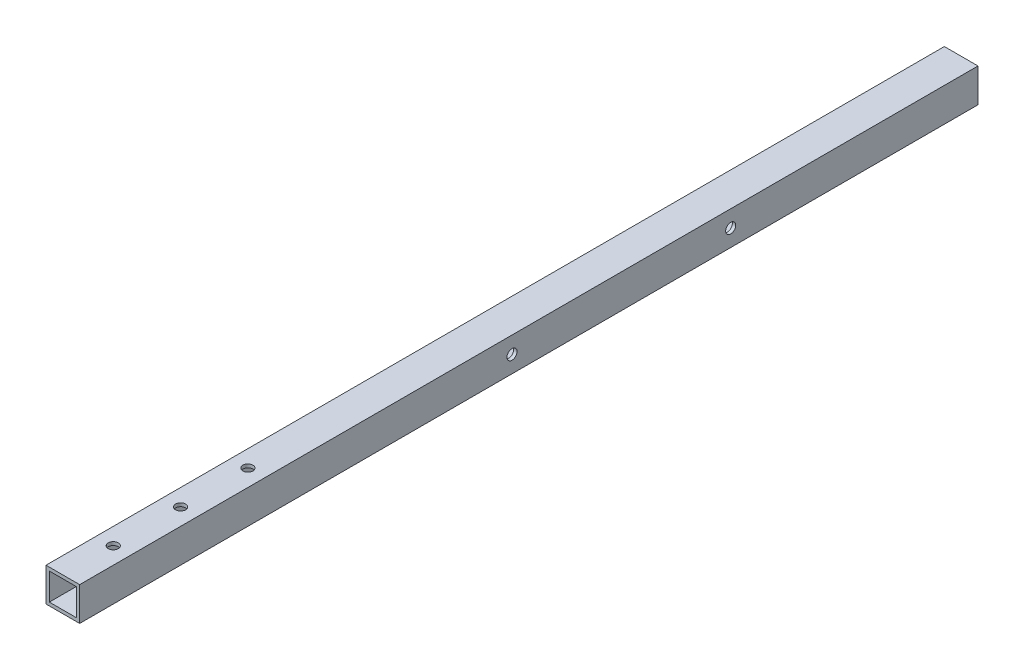
ISO-10303-21;
HEADER;
FILE_DESCRIPTION(('STEP AP214'),'2;1');
FILE_NAME('part.step','',(''),(''),'','','');
FILE_SCHEMA(('AUTOMOTIVE_DESIGN { 1 0 10303 214 1 1 1 1 }'));
ENDSEC;
DATA;
#1=APPLICATION_CONTEXT('core data for automotive mechanical design processes');
#2=APPLICATION_PROTOCOL_DEFINITION('international standard','automotive_design',2000,#1);
#3=PRODUCT_CONTEXT('',#1,'mechanical');
#4=PRODUCT('Part','Part','',(#3));
#5=PRODUCT_RELATED_PRODUCT_CATEGORY('part','',(#4));
#6=PRODUCT_DEFINITION_FORMATION('','',#4);
#7=PRODUCT_DEFINITION_CONTEXT('part definition',#1,'design');
#8=PRODUCT_DEFINITION('design','',#6,#7);
#9=PRODUCT_DEFINITION_SHAPE('','',#8);
#10=(LENGTH_UNIT() NAMED_UNIT(*) SI_UNIT(.MILLI.,.METRE.));
#11=(NAMED_UNIT(*) PLANE_ANGLE_UNIT() SI_UNIT($,.RADIAN.));
#12=(NAMED_UNIT(*) SI_UNIT($,.STERADIAN.) SOLID_ANGLE_UNIT());
#13=UNCERTAINTY_MEASURE_WITH_UNIT(LENGTH_MEASURE(1.E-05),#10,'distance_accuracy_value','');
#14=(GEOMETRIC_REPRESENTATION_CONTEXT(3) GLOBAL_UNCERTAINTY_ASSIGNED_CONTEXT((#13)) GLOBAL_UNIT_ASSIGNED_CONTEXT((#10,
#11,#12)) REPRESENTATION_CONTEXT('',''));
#15=CARTESIAN_POINT('',(0.,0.,0.));
#16=DIRECTION('',(0.,0.,1.));
#17=DIRECTION('',(1.,0.,0.));
#18=AXIS2_PLACEMENT_3D('',#15,#16,#17);
#19=CARTESIAN_POINT('',(0.,0.,133.5));
#20=DIRECTION('',(0.,0.,-1.));
#21=DIRECTION('',(-1.,0.,0.));
#22=AXIS2_PLACEMENT_3D('',#19,#20,#21);
#23=PLANE('',#22);
#24=DIRECTION('',(0.,1.,0.));
#25=VECTOR('',#24,1.);
#26=CARTESIAN_POINT('',(5.,-5.,133.5));
#27=LINE('',#26,#25);
#28=CARTESIAN_POINT('',(5.,-5.,133.5));
#29=VERTEX_POINT('',#28);
#30=CARTESIAN_POINT('',(5.,5.,133.5));
#31=VERTEX_POINT('',#30);
#32=EDGE_CURVE('E140',#29,#31,#27,.T.);
#33=ORIENTED_EDGE('',*,*,#32,.T.);
#34=DIRECTION('',(-1.,0.,0.));
#35=VECTOR('',#34,1.);
#36=CARTESIAN_POINT('',(-5.,5.,133.5));
#37=LINE('',#36,#35);
#38=CARTESIAN_POINT('',(-5.,5.,133.5));
#39=VERTEX_POINT('',#38);
#40=EDGE_CURVE('E143',#31,#39,#37,.T.);
#41=ORIENTED_EDGE('',*,*,#40,.T.);
#42=DIRECTION('',(0.,-1.,0.));
#43=VECTOR('',#42,1.);
#44=CARTESIAN_POINT('',(-5.,-5.,133.5));
#45=LINE('',#44,#43);
#46=CARTESIAN_POINT('',(-5.,-5.,133.5));
#47=VERTEX_POINT('',#46);
#48=EDGE_CURVE('E146',#39,#47,#45,.T.);
#49=ORIENTED_EDGE('',*,*,#48,.T.);
#50=DIRECTION('',(1.,0.,0.));
#51=VECTOR('',#50,1.);
#52=CARTESIAN_POINT('',(-5.,-5.,133.5));
#53=LINE('',#52,#51);
#54=EDGE_CURVE('E148',#47,#29,#53,.T.);
#55=ORIENTED_EDGE('',*,*,#54,.T.);
#56=EDGE_LOOP('',(#33,#41,#49,#55));
#57=FACE_BOUND('',#56,.T.);
#58=DIRECTION('',(1.,0.,0.));
#59=VECTOR('',#58,1.);
#60=CARTESIAN_POINT('',(-4.,-4.,133.5));
#61=LINE('',#60,#59);
#62=CARTESIAN_POINT('',(-4.,-4.,133.5));
#63=VERTEX_POINT('',#62);
#64=CARTESIAN_POINT('',(4.,-4.,133.5));
#65=VERTEX_POINT('',#64);
#66=EDGE_CURVE('E102',#63,#65,#61,.T.);
#67=ORIENTED_EDGE('',*,*,#66,.F.);
#68=DIRECTION('',(0.,-1.,0.));
#69=VECTOR('',#68,1.);
#70=CARTESIAN_POINT('',(-4.,-4.,133.5));
#71=LINE('',#70,#69);
#72=CARTESIAN_POINT('',(-4.,4.,133.5));
#73=VERTEX_POINT('',#72);
#74=EDGE_CURVE('E124',#73,#63,#71,.T.);
#75=ORIENTED_EDGE('',*,*,#74,.F.);
#76=DIRECTION('',(-1.,0.,0.));
#77=VECTOR('',#76,1.);
#78=CARTESIAN_POINT('',(-4.,4.,133.5));
#79=LINE('',#78,#77);
#80=CARTESIAN_POINT('',(4.,4.,133.5));
#81=VERTEX_POINT('',#80);
#82=EDGE_CURVE('E122',#81,#73,#79,.T.);
#83=ORIENTED_EDGE('',*,*,#82,.F.);
#84=DIRECTION('',(0.,1.,0.));
#85=VECTOR('',#84,1.);
#86=CARTESIAN_POINT('',(4.,-4.,133.5));
#87=LINE('',#86,#85);
#88=EDGE_CURVE('E110',#65,#81,#87,.T.);
#89=ORIENTED_EDGE('',*,*,#88,.F.);
#90=EDGE_LOOP('',(#67,#75,#83,#89));
#91=FACE_BOUND('',#90,.T.);
#92=ADVANCED_FACE('F35',(#57,#91),#23,.F.);
#93=CARTESIAN_POINT('',(0.,0.,-133.5));
#94=DIRECTION('',(0.,0.,-1.));
#95=DIRECTION('',(-1.,0.,0.));
#96=AXIS2_PLACEMENT_3D('',#93,#94,#95);
#97=PLANE('',#96);
#98=DIRECTION('',(0.,1.,0.));
#99=VECTOR('',#98,1.);
#100=CARTESIAN_POINT('',(5.,-5.,-133.5));
#101=LINE('',#100,#99);
#102=CARTESIAN_POINT('',(5.,-5.,-133.5));
#103=VERTEX_POINT('',#102);
#104=CARTESIAN_POINT('',(5.,5.,-133.5));
#105=VERTEX_POINT('',#104);
#106=EDGE_CURVE('E118',#103,#105,#101,.T.);
#107=ORIENTED_EDGE('',*,*,#106,.F.);
#108=DIRECTION('',(1.,0.,0.));
#109=VECTOR('',#108,1.);
#110=CARTESIAN_POINT('',(-5.,-5.,-133.5));
#111=LINE('',#110,#109);
#112=CARTESIAN_POINT('',(-5.,-5.,-133.5));
#113=VERTEX_POINT('',#112);
#114=EDGE_CURVE('E144',#113,#103,#111,.T.);
#115=ORIENTED_EDGE('',*,*,#114,.F.);
#116=DIRECTION('',(0.,-1.,0.));
#117=VECTOR('',#116,1.);
#118=CARTESIAN_POINT('',(-5.,-5.,-133.5));
#119=LINE('',#118,#117);
#120=CARTESIAN_POINT('',(-5.,5.,-133.5));
#121=VERTEX_POINT('',#120);
#122=EDGE_CURVE('E155',#121,#113,#119,.T.);
#123=ORIENTED_EDGE('',*,*,#122,.F.);
#124=DIRECTION('',(-1.,0.,0.));
#125=VECTOR('',#124,1.);
#126=CARTESIAN_POINT('',(-5.,5.,-133.5));
#127=LINE('',#126,#125);
#128=EDGE_CURVE('E153',#105,#121,#127,.T.);
#129=ORIENTED_EDGE('',*,*,#128,.F.);
#130=EDGE_LOOP('',(#107,#115,#123,#129));
#131=FACE_BOUND('',#130,.T.);
#132=DIRECTION('',(0.,-1.,0.));
#133=VECTOR('',#132,1.);
#134=CARTESIAN_POINT('',(-4.,-4.,-133.5));
#135=LINE('',#134,#133);
#136=CARTESIAN_POINT('',(-4.,4.,-133.5));
#137=VERTEX_POINT('',#136);
#138=CARTESIAN_POINT('',(-4.,-4.,-133.5));
#139=VERTEX_POINT('',#138);
#140=EDGE_CURVE('E111',#137,#139,#135,.T.);
#141=ORIENTED_EDGE('',*,*,#140,.T.);
#142=DIRECTION('',(1.,0.,0.));
#143=VECTOR('',#142,1.);
#144=CARTESIAN_POINT('',(-4.,-4.,-133.5));
#145=LINE('',#144,#143);
#146=CARTESIAN_POINT('',(4.,-4.,-133.5));
#147=VERTEX_POINT('',#146);
#148=EDGE_CURVE('E60',#139,#147,#145,.T.);
#149=ORIENTED_EDGE('',*,*,#148,.T.);
#150=DIRECTION('',(0.,1.,0.));
#151=VECTOR('',#150,1.);
#152=CARTESIAN_POINT('',(4.,-4.,-133.5));
#153=LINE('',#152,#151);
#154=CARTESIAN_POINT('',(4.,4.,-133.5));
#155=VERTEX_POINT('',#154);
#156=EDGE_CURVE('E117',#147,#155,#153,.T.);
#157=ORIENTED_EDGE('',*,*,#156,.T.);
#158=DIRECTION('',(-1.,0.,0.));
#159=VECTOR('',#158,1.);
#160=CARTESIAN_POINT('',(-4.,4.,-133.5));
#161=LINE('',#160,#159);
#162=EDGE_CURVE('E132',#155,#137,#161,.T.);
#163=ORIENTED_EDGE('',*,*,#162,.T.);
#164=EDGE_LOOP('',(#141,#149,#157,#163));
#165=FACE_BOUND('',#164,.T.);
#166=ADVANCED_FACE('F249',(#131,#165),#97,.T.);
#167=CARTESIAN_POINT('',(5.,-5.,133.5));
#168=DIRECTION('',(-1.,0.,0.));
#169=DIRECTION('',(0.,-1.,0.));
#170=AXIS2_PLACEMENT_3D('',#167,#168,#169);
#171=PLANE('',#170);
#172=CARTESIAN_POINT('',(5.,0.,-60.));
#173=DIRECTION('',(-1.,0.,0.));
#174=DIRECTION('',(0.,-1.,0.));
#175=AXIS2_PLACEMENT_3D('',#172,#173,#174);
#176=CIRCLE('',#175,1.5);
#177=CARTESIAN_POINT('',(5.,-1.5,-60.));
#178=VERTEX_POINT('',#177);
#179=EDGE_CURVE('E169',#178,#178,#176,.T.);
#180=ORIENTED_EDGE('',*,*,#179,.T.);
#181=EDGE_LOOP('',(#180));
#182=FACE_BOUND('',#181,.T.);
#183=CARTESIAN_POINT('',(5.,0.,5.00000000000005));
#184=DIRECTION('',(-1.,0.,0.));
#185=DIRECTION('',(0.,-1.,0.));
#186=AXIS2_PLACEMENT_3D('',#183,#184,#185);
#187=CIRCLE('',#186,1.5);
#188=CARTESIAN_POINT('',(5.,-1.5,5.00000000000005));
#189=VERTEX_POINT('',#188);
#190=EDGE_CURVE('E186',#189,#189,#187,.T.);
#191=ORIENTED_EDGE('',*,*,#190,.T.);
#192=EDGE_LOOP('',(#191));
#193=FACE_BOUND('',#192,.T.);
#194=ORIENTED_EDGE('',*,*,#106,.T.);
#195=DIRECTION('',(0.,0.,-1.));
#196=VECTOR('',#195,1.);
#197=CARTESIAN_POINT('',(5.,5.,133.5));
#198=LINE('',#197,#196);
#199=EDGE_CURVE('E11',#31,#105,#198,.T.);
#200=ORIENTED_EDGE('',*,*,#199,.F.);
#201=ORIENTED_EDGE('',*,*,#32,.F.);
#202=DIRECTION('',(0.,0.,-1.));
#203=VECTOR('',#202,1.);
#204=CARTESIAN_POINT('',(5.,-5.,133.5));
#205=LINE('',#204,#203);
#206=EDGE_CURVE('E150',#29,#103,#205,.T.);
#207=ORIENTED_EDGE('',*,*,#206,.T.);
#208=EDGE_LOOP('',(#194,#200,#201,#207));
#209=FACE_BOUND('',#208,.T.);
#210=ADVANCED_FACE('F37',(#182,#193,#209),#171,.F.);
#211=CARTESIAN_POINT('',(-5.,5.,133.5));
#212=DIRECTION('',(0.,-1.,0.));
#213=DIRECTION('',(1.,0.,0.));
#214=AXIS2_PLACEMENT_3D('',#211,#212,#213);
#215=PLANE('',#214);
#216=CARTESIAN_POINT('',(0.,5.,118.5));
#217=DIRECTION('',(0.,-1.,0.));
#218=DIRECTION('',(1.,0.,0.));
#219=AXIS2_PLACEMENT_3D('',#216,#217,#218);
#220=CIRCLE('',#219,1.5);
#221=CARTESIAN_POINT('',(1.5,5.,118.5));
#222=VERTEX_POINT('',#221);
#223=EDGE_CURVE('E130',#222,#222,#220,.T.);
#224=ORIENTED_EDGE('',*,*,#223,.T.);
#225=EDGE_LOOP('',(#224));
#226=FACE_BOUND('',#225,.T.);
#227=CARTESIAN_POINT('',(0.,5.,98.5));
#228=DIRECTION('',(0.,-1.,0.));
#229=DIRECTION('',(1.,0.,0.));
#230=AXIS2_PLACEMENT_3D('',#227,#228,#229);
#231=CIRCLE('',#230,1.5);
#232=CARTESIAN_POINT('',(1.5,5.,98.5));
#233=VERTEX_POINT('',#232);
#234=EDGE_CURVE('E178',#233,#233,#231,.T.);
#235=ORIENTED_EDGE('',*,*,#234,.T.);
#236=EDGE_LOOP('',(#235));
#237=FACE_BOUND('',#236,.T.);
#238=CARTESIAN_POINT('',(0.,5.,78.5));
#239=DIRECTION('',(0.,-1.,0.));
#240=DIRECTION('',(1.,0.,0.));
#241=AXIS2_PLACEMENT_3D('',#238,#239,#240);
#242=CIRCLE('',#241,1.5);
#243=CARTESIAN_POINT('',(1.5,5.,78.5));
#244=VERTEX_POINT('',#243);
#245=EDGE_CURVE('E174',#244,#244,#242,.T.);
#246=ORIENTED_EDGE('',*,*,#245,.T.);
#247=EDGE_LOOP('',(#246));
#248=FACE_BOUND('',#247,.T.);
#249=ORIENTED_EDGE('',*,*,#128,.T.);
#250=DIRECTION('',(0.,0.,-1.));
#251=VECTOR('',#250,1.);
#252=CARTESIAN_POINT('',(-5.,5.,133.5));
#253=LINE('',#252,#251);
#254=EDGE_CURVE('E44',#39,#121,#253,.T.);
#255=ORIENTED_EDGE('',*,*,#254,.F.);
#256=ORIENTED_EDGE('',*,*,#40,.F.);
#257=ORIENTED_EDGE('',*,*,#199,.T.);
#258=EDGE_LOOP('',(#249,#255,#256,#257));
#259=FACE_BOUND('',#258,.T.);
#260=ADVANCED_FACE('F224',(#226,#237,#248,#259),#215,.F.);
#261=CARTESIAN_POINT('',(-5.,-5.,133.5));
#262=DIRECTION('',(1.,0.,0.));
#263=DIRECTION('',(0.,1.,0.));
#264=AXIS2_PLACEMENT_3D('',#261,#262,#263);
#265=PLANE('',#264);
#266=CARTESIAN_POINT('',(-5.,0.,-60.));
#267=DIRECTION('',(-1.,0.,0.));
#268=DIRECTION('',(0.,-1.,0.));
#269=AXIS2_PLACEMENT_3D('',#266,#267,#268);
#270=CIRCLE('',#269,1.5);
#271=CARTESIAN_POINT('',(-5.,-1.5,-60.));
#272=VERTEX_POINT('',#271);
#273=EDGE_CURVE('E182',#272,#272,#270,.T.);
#274=ORIENTED_EDGE('',*,*,#273,.F.);
#275=EDGE_LOOP('',(#274));
#276=FACE_BOUND('',#275,.T.);
#277=CARTESIAN_POINT('',(-5.,0.,5.00000000000005));
#278=DIRECTION('',(-1.,0.,0.));
#279=DIRECTION('',(0.,-1.,0.));
#280=AXIS2_PLACEMENT_3D('',#277,#278,#279);
#281=CIRCLE('',#280,1.5);
#282=CARTESIAN_POINT('',(-5.,-1.5,5.00000000000005));
#283=VERTEX_POINT('',#282);
#284=EDGE_CURVE('E189',#283,#283,#281,.T.);
#285=ORIENTED_EDGE('',*,*,#284,.F.);
#286=EDGE_LOOP('',(#285));
#287=FACE_BOUND('',#286,.T.);
#288=ORIENTED_EDGE('',*,*,#122,.T.);
#289=DIRECTION('',(0.,0.,-1.));
#290=VECTOR('',#289,1.);
#291=CARTESIAN_POINT('',(-5.,-5.,133.5));
#292=LINE('',#291,#290);
#293=EDGE_CURVE('E160',#47,#113,#292,.T.);
#294=ORIENTED_EDGE('',*,*,#293,.F.);
#295=ORIENTED_EDGE('',*,*,#48,.F.);
#296=ORIENTED_EDGE('',*,*,#254,.T.);
#297=EDGE_LOOP('',(#288,#294,#295,#296));
#298=FACE_BOUND('',#297,.T.);
#299=ADVANCED_FACE('F263',(#276,#287,#298),#265,.F.);
#300=CARTESIAN_POINT('',(-5.,-5.,133.5));
#301=DIRECTION('',(0.,1.,0.));
#302=DIRECTION('',(-1.,0.,0.));
#303=AXIS2_PLACEMENT_3D('',#300,#301,#302);
#304=PLANE('',#303);
#305=CARTESIAN_POINT('',(0.,-5.,118.5));
#306=DIRECTION('',(0.,1.,0.));
#307=DIRECTION('',(-1.,0.,0.));
#308=AXIS2_PLACEMENT_3D('',#305,#306,#307);
#309=CIRCLE('',#308,1.5);
#310=CARTESIAN_POINT('',(-1.5,-5.,118.5));
#311=VERTEX_POINT('',#310);
#312=EDGE_CURVE('E219',#311,#311,#309,.T.);
#313=ORIENTED_EDGE('',*,*,#312,.T.);
#314=EDGE_LOOP('',(#313));
#315=FACE_BOUND('',#314,.T.);
#316=CARTESIAN_POINT('',(0.,-5.,98.5));
#317=DIRECTION('',(0.,1.,0.));
#318=DIRECTION('',(-1.,0.,0.));
#319=AXIS2_PLACEMENT_3D('',#316,#317,#318);
#320=CIRCLE('',#319,1.5);
#321=CARTESIAN_POINT('',(-1.5,-5.,98.5));
#322=VERTEX_POINT('',#321);
#323=EDGE_CURVE('E212',#322,#322,#320,.T.);
#324=ORIENTED_EDGE('',*,*,#323,.T.);
#325=EDGE_LOOP('',(#324));
#326=FACE_BOUND('',#325,.T.);
#327=CARTESIAN_POINT('',(0.,-5.,78.5));
#328=DIRECTION('',(0.,1.,0.));
#329=DIRECTION('',(-1.,0.,0.));
#330=AXIS2_PLACEMENT_3D('',#327,#328,#329);
#331=CIRCLE('',#330,1.5);
#332=CARTESIAN_POINT('',(-1.5,-5.,78.5));
#333=VERTEX_POINT('',#332);
#334=EDGE_CURVE('E205',#333,#333,#331,.T.);
#335=ORIENTED_EDGE('',*,*,#334,.T.);
#336=EDGE_LOOP('',(#335));
#337=FACE_BOUND('',#336,.T.);
#338=ORIENTED_EDGE('',*,*,#114,.T.);
#339=ORIENTED_EDGE('',*,*,#206,.F.);
#340=ORIENTED_EDGE('',*,*,#54,.F.);
#341=ORIENTED_EDGE('',*,*,#293,.T.);
#342=EDGE_LOOP('',(#338,#339,#340,#341));
#343=FACE_BOUND('',#342,.T.);
#344=ADVANCED_FACE('F260',(#315,#326,#337,#343),#304,.F.);
#345=CARTESIAN_POINT('',(-4.,-4.,133.5));
#346=DIRECTION('',(0.,1.,0.));
#347=DIRECTION('',(0.,0.,1.));
#348=AXIS2_PLACEMENT_3D('',#345,#346,#347);
#349=PLANE('',#348);
#350=CARTESIAN_POINT('',(0.,-4.,118.5));
#351=DIRECTION('',(0.,1.,0.));
#352=DIRECTION('',(0.,0.,1.));
#353=AXIS2_PLACEMENT_3D('',#350,#351,#352);
#354=CIRCLE('',#353,1.5);
#355=CARTESIAN_POINT('',(0.,-4.,120.));
#356=VERTEX_POINT('',#355);
#357=EDGE_CURVE('E177',#356,#356,#354,.T.);
#358=ORIENTED_EDGE('',*,*,#357,.F.);
#359=EDGE_LOOP('',(#358));
#360=FACE_BOUND('',#359,.T.);
#361=CARTESIAN_POINT('',(0.,-4.,98.5));
#362=DIRECTION('',(0.,1.,0.));
#363=DIRECTION('',(0.,0.,1.));
#364=AXIS2_PLACEMENT_3D('',#361,#362,#363);
#365=CIRCLE('',#364,1.5);
#366=CARTESIAN_POINT('',(0.,-4.,100.));
#367=VERTEX_POINT('',#366);
#368=EDGE_CURVE('E173',#367,#367,#365,.T.);
#369=ORIENTED_EDGE('',*,*,#368,.F.);
#370=EDGE_LOOP('',(#369));
#371=FACE_BOUND('',#370,.T.);
#372=CARTESIAN_POINT('',(0.,-4.,78.5));
#373=DIRECTION('',(0.,1.,0.));
#374=DIRECTION('',(0.,0.,1.));
#375=AXIS2_PLACEMENT_3D('',#372,#373,#374);
#376=CIRCLE('',#375,1.5);
#377=CARTESIAN_POINT('',(0.,-4.,80.));
#378=VERTEX_POINT('',#377);
#379=EDGE_CURVE('E168',#378,#378,#376,.T.);
#380=ORIENTED_EDGE('',*,*,#379,.F.);
#381=EDGE_LOOP('',(#380));
#382=FACE_BOUND('',#381,.T.);
#383=ORIENTED_EDGE('',*,*,#148,.F.);
#384=DIRECTION('',(0.,0.,-1.));
#385=VECTOR('',#384,1.);
#386=CARTESIAN_POINT('',(-4.,-4.,133.5));
#387=LINE('',#386,#385);
#388=EDGE_CURVE('E106',#63,#139,#387,.T.);
#389=ORIENTED_EDGE('',*,*,#388,.F.);
#390=ORIENTED_EDGE('',*,*,#66,.T.);
#391=DIRECTION('',(0.,0.,-1.));
#392=VECTOR('',#391,1.);
#393=CARTESIAN_POINT('',(4.,-4.,133.5));
#394=LINE('',#393,#392);
#395=EDGE_CURVE('E105',#65,#147,#394,.T.);
#396=ORIENTED_EDGE('',*,*,#395,.T.);
#397=EDGE_LOOP('',(#383,#389,#390,#396));
#398=FACE_BOUND('',#397,.T.);
#399=ADVANCED_FACE('F104',(#360,#371,#382,#398),#349,.T.);
#400=CARTESIAN_POINT('',(4.,-4.,133.5));
#401=DIRECTION('',(-1.,0.,0.));
#402=DIRECTION('',(0.,0.,1.));
#403=AXIS2_PLACEMENT_3D('',#400,#401,#402);
#404=PLANE('',#403);
#405=CARTESIAN_POINT('',(4.,0.,-60.));
#406=DIRECTION('',(-1.,0.,0.));
#407=DIRECTION('',(0.,0.,1.));
#408=AXIS2_PLACEMENT_3D('',#405,#406,#407);
#409=CIRCLE('',#408,1.5);
#410=CARTESIAN_POINT('',(4.,0.,-58.5));
#411=VERTEX_POINT('',#410);
#412=EDGE_CURVE('E198',#411,#411,#409,.T.);
#413=ORIENTED_EDGE('',*,*,#412,.F.);
#414=EDGE_LOOP('',(#413));
#415=FACE_BOUND('',#414,.T.);
#416=CARTESIAN_POINT('',(4.,0.,5.00000000000005));
#417=DIRECTION('',(-1.,0.,0.));
#418=DIRECTION('',(0.,0.,1.));
#419=AXIS2_PLACEMENT_3D('',#416,#417,#418);
#420=CIRCLE('',#419,1.5);
#421=CARTESIAN_POINT('',(4.,0.,6.50000000000005));
#422=VERTEX_POINT('',#421);
#423=EDGE_CURVE('E181',#422,#422,#420,.T.);
#424=ORIENTED_EDGE('',*,*,#423,.F.);
#425=EDGE_LOOP('',(#424));
#426=FACE_BOUND('',#425,.T.);
#427=ORIENTED_EDGE('',*,*,#156,.F.);
#428=ORIENTED_EDGE('',*,*,#395,.F.);
#429=ORIENTED_EDGE('',*,*,#88,.T.);
#430=DIRECTION('',(0.,0.,-1.));
#431=VECTOR('',#430,1.);
#432=CARTESIAN_POINT('',(4.,4.,133.5));
#433=LINE('',#432,#431);
#434=EDGE_CURVE('E119',#81,#155,#433,.T.);
#435=ORIENTED_EDGE('',*,*,#434,.T.);
#436=EDGE_LOOP('',(#427,#428,#429,#435));
#437=FACE_BOUND('',#436,.T.);
#438=ADVANCED_FACE('F114',(#415,#426,#437),#404,.T.);
#439=CARTESIAN_POINT('',(-4.,4.,133.5));
#440=DIRECTION('',(0.,-1.,0.));
#441=DIRECTION('',(1.,0.,0.));
#442=AXIS2_PLACEMENT_3D('',#439,#440,#441);
#443=PLANE('',#442);
#444=CARTESIAN_POINT('',(0.,4.,118.5));
#445=DIRECTION('',(0.,-1.,0.));
#446=DIRECTION('',(1.,0.,0.));
#447=AXIS2_PLACEMENT_3D('',#444,#445,#446);
#448=CIRCLE('',#447,1.5);
#449=CARTESIAN_POINT('',(1.5,4.,118.5));
#450=VERTEX_POINT('',#449);
#451=EDGE_CURVE('E175',#450,#450,#448,.T.);
#452=ORIENTED_EDGE('',*,*,#451,.F.);
#453=EDGE_LOOP('',(#452));
#454=FACE_BOUND('',#453,.T.);
#455=CARTESIAN_POINT('',(0.,4.,98.5));
#456=DIRECTION('',(0.,-1.,0.));
#457=DIRECTION('',(1.,0.,0.));
#458=AXIS2_PLACEMENT_3D('',#455,#456,#457);
#459=CIRCLE('',#458,1.5);
#460=CARTESIAN_POINT('',(1.5,4.,98.5));
#461=VERTEX_POINT('',#460);
#462=EDGE_CURVE('E170',#461,#461,#459,.T.);
#463=ORIENTED_EDGE('',*,*,#462,.F.);
#464=EDGE_LOOP('',(#463));
#465=FACE_BOUND('',#464,.T.);
#466=CARTESIAN_POINT('',(0.,4.,78.5));
#467=DIRECTION('',(0.,-1.,0.));
#468=DIRECTION('',(1.,0.,0.));
#469=AXIS2_PLACEMENT_3D('',#466,#467,#468);
#470=CIRCLE('',#469,1.5);
#471=CARTESIAN_POINT('',(1.5,4.,78.5));
#472=VERTEX_POINT('',#471);
#473=EDGE_CURVE('E165',#472,#472,#470,.T.);
#474=ORIENTED_EDGE('',*,*,#473,.F.);
#475=EDGE_LOOP('',(#474));
#476=FACE_BOUND('',#475,.T.);
#477=ORIENTED_EDGE('',*,*,#162,.F.);
#478=ORIENTED_EDGE('',*,*,#434,.F.);
#479=ORIENTED_EDGE('',*,*,#82,.T.);
#480=DIRECTION('',(0.,0.,-1.));
#481=VECTOR('',#480,1.);
#482=CARTESIAN_POINT('',(-4.,4.,133.5));
#483=LINE('',#482,#481);
#484=EDGE_CURVE('E52',#73,#137,#483,.T.);
#485=ORIENTED_EDGE('',*,*,#484,.T.);
#486=EDGE_LOOP('',(#477,#478,#479,#485));
#487=FACE_BOUND('',#486,.T.);
#488=ADVANCED_FACE('F297',(#454,#465,#476,#487),#443,.T.);
#489=CARTESIAN_POINT('',(-4.,-4.,133.5));
#490=DIRECTION('',(1.,0.,0.));
#491=DIRECTION('',(0.,0.,-1.));
#492=AXIS2_PLACEMENT_3D('',#489,#490,#491);
#493=PLANE('',#492);
#494=CARTESIAN_POINT('',(-4.,0.,-60.));
#495=DIRECTION('',(1.,0.,0.));
#496=DIRECTION('',(0.,0.,-1.));
#497=AXIS2_PLACEMENT_3D('',#494,#495,#496);
#498=CIRCLE('',#497,1.5);
#499=CARTESIAN_POINT('',(-4.,0.,-61.5));
#500=VERTEX_POINT('',#499);
#501=EDGE_CURVE('E39',#500,#500,#498,.T.);
#502=ORIENTED_EDGE('',*,*,#501,.F.);
#503=EDGE_LOOP('',(#502));
#504=FACE_BOUND('',#503,.T.);
#505=CARTESIAN_POINT('',(-4.,0.,5.00000000000005));
#506=DIRECTION('',(1.,0.,0.));
#507=DIRECTION('',(0.,0.,-1.));
#508=AXIS2_PLACEMENT_3D('',#505,#506,#507);
#509=CIRCLE('',#508,1.5);
#510=CARTESIAN_POINT('',(-4.,0.,3.50000000000005));
#511=VERTEX_POINT('',#510);
#512=EDGE_CURVE('E179',#511,#511,#509,.T.);
#513=ORIENTED_EDGE('',*,*,#512,.F.);
#514=EDGE_LOOP('',(#513));
#515=FACE_BOUND('',#514,.T.);
#516=ORIENTED_EDGE('',*,*,#140,.F.);
#517=ORIENTED_EDGE('',*,*,#484,.F.);
#518=ORIENTED_EDGE('',*,*,#74,.T.);
#519=ORIENTED_EDGE('',*,*,#388,.T.);
#520=EDGE_LOOP('',(#516,#517,#518,#519));
#521=FACE_BOUND('',#520,.T.);
#522=ADVANCED_FACE('F295',(#504,#515,#521),#493,.T.);
#523=CARTESIAN_POINT('',(0.,15.,78.5));
#524=DIRECTION('',(0.,-1.,0.));
#525=DIRECTION('',(1.,0.,0.));
#526=AXIS2_PLACEMENT_3D('',#523,#524,#525);
#527=CYLINDRICAL_SURFACE('',#526,1.5);
#528=ORIENTED_EDGE('',*,*,#473,.T.);
#529=EDGE_LOOP('',(#528));
#530=FACE_BOUND('',#529,.T.);
#531=ORIENTED_EDGE('',*,*,#245,.F.);
#532=EDGE_LOOP('',(#531));
#533=FACE_BOUND('',#532,.T.);
#534=ADVANCED_FACE('F241',(#530,#533),#527,.F.);
#535=CARTESIAN_POINT('',(0.,15.,98.5));
#536=DIRECTION('',(0.,-1.,0.));
#537=DIRECTION('',(1.,0.,0.));
#538=AXIS2_PLACEMENT_3D('',#535,#536,#537);
#539=CYLINDRICAL_SURFACE('',#538,1.5);
#540=ORIENTED_EDGE('',*,*,#462,.T.);
#541=EDGE_LOOP('',(#540));
#542=FACE_BOUND('',#541,.T.);
#543=ORIENTED_EDGE('',*,*,#234,.F.);
#544=EDGE_LOOP('',(#543));
#545=FACE_BOUND('',#544,.T.);
#546=ADVANCED_FACE('F230',(#542,#545),#539,.F.);
#547=CARTESIAN_POINT('',(0.,15.,118.5));
#548=DIRECTION('',(0.,-1.,0.));
#549=DIRECTION('',(1.,0.,0.));
#550=AXIS2_PLACEMENT_3D('',#547,#548,#549);
#551=CYLINDRICAL_SURFACE('',#550,1.5);
#552=ORIENTED_EDGE('',*,*,#451,.T.);
#553=EDGE_LOOP('',(#552));
#554=FACE_BOUND('',#553,.T.);
#555=ORIENTED_EDGE('',*,*,#223,.F.);
#556=EDGE_LOOP('',(#555));
#557=FACE_BOUND('',#556,.T.);
#558=ADVANCED_FACE('F227',(#554,#557),#551,.F.);
#559=ORIENTED_EDGE('',*,*,#379,.T.);
#560=EDGE_LOOP('',(#559));
#561=FACE_BOUND('',#560,.T.);
#562=ORIENTED_EDGE('',*,*,#334,.F.);
#563=EDGE_LOOP('',(#562));
#564=FACE_BOUND('',#563,.T.);
#565=ADVANCED_FACE('F229',(#561,#564),#527,.F.);
#566=ORIENTED_EDGE('',*,*,#368,.T.);
#567=EDGE_LOOP('',(#566));
#568=FACE_BOUND('',#567,.T.);
#569=ORIENTED_EDGE('',*,*,#323,.F.);
#570=EDGE_LOOP('',(#569));
#571=FACE_BOUND('',#570,.T.);
#572=ADVANCED_FACE('F238',(#568,#571),#539,.F.);
#573=ORIENTED_EDGE('',*,*,#357,.T.);
#574=EDGE_LOOP('',(#573));
#575=FACE_BOUND('',#574,.T.);
#576=ORIENTED_EDGE('',*,*,#312,.F.);
#577=EDGE_LOOP('',(#576));
#578=FACE_BOUND('',#577,.T.);
#579=ADVANCED_FACE('F233',(#575,#578),#551,.F.);
#580=CARTESIAN_POINT('',(35.,0.,5.00000000000005));
#581=DIRECTION('',(-1.,0.,0.));
#582=DIRECTION('',(0.,-1.,0.));
#583=AXIS2_PLACEMENT_3D('',#580,#581,#582);
#584=CYLINDRICAL_SURFACE('',#583,1.5);
#585=ORIENTED_EDGE('',*,*,#512,.T.);
#586=EDGE_LOOP('',(#585));
#587=FACE_BOUND('',#586,.T.);
#588=ORIENTED_EDGE('',*,*,#284,.T.);
#589=EDGE_LOOP('',(#588));
#590=FACE_BOUND('',#589,.T.);
#591=ADVANCED_FACE('F246',(#587,#590),#584,.F.);
#592=CARTESIAN_POINT('',(35.,0.,-60.));
#593=DIRECTION('',(-1.,0.,0.));
#594=DIRECTION('',(0.,-1.,0.));
#595=AXIS2_PLACEMENT_3D('',#592,#593,#594);
#596=CYLINDRICAL_SURFACE('',#595,1.5);
#597=ORIENTED_EDGE('',*,*,#501,.T.);
#598=EDGE_LOOP('',(#597));
#599=FACE_BOUND('',#598,.T.);
#600=ORIENTED_EDGE('',*,*,#273,.T.);
#601=EDGE_LOOP('',(#600));
#602=FACE_BOUND('',#601,.T.);
#603=ADVANCED_FACE('F324',(#599,#602),#596,.F.);
#604=ORIENTED_EDGE('',*,*,#423,.T.);
#605=EDGE_LOOP('',(#604));
#606=FACE_BOUND('',#605,.T.);
#607=ORIENTED_EDGE('',*,*,#190,.F.);
#608=EDGE_LOOP('',(#607));
#609=FACE_BOUND('',#608,.T.);
#610=ADVANCED_FACE('F320',(#606,#609),#584,.F.);
#611=ORIENTED_EDGE('',*,*,#412,.T.);
#612=EDGE_LOOP('',(#611));
#613=FACE_BOUND('',#612,.T.);
#614=ORIENTED_EDGE('',*,*,#179,.F.);
#615=EDGE_LOOP('',(#614));
#616=FACE_BOUND('',#615,.T.);
#617=ADVANCED_FACE('F323',(#613,#616),#596,.F.);
#618=CLOSED_SHELL('',(#92,#166,#210,#260,#299,#344,#399,#438,#488,#522,#534,#546,#558,#565,#572,
#579,#591,#603,#610,#617));
#619=MANIFOLD_SOLID_BREP('B2',#618);
#620=ADVANCED_BREP_SHAPE_REPRESENTATION('',(#18,#619),#14);
#621=SHAPE_DEFINITION_REPRESENTATION(#9,#620);
ENDSEC;
END-ISO-10303-21;
